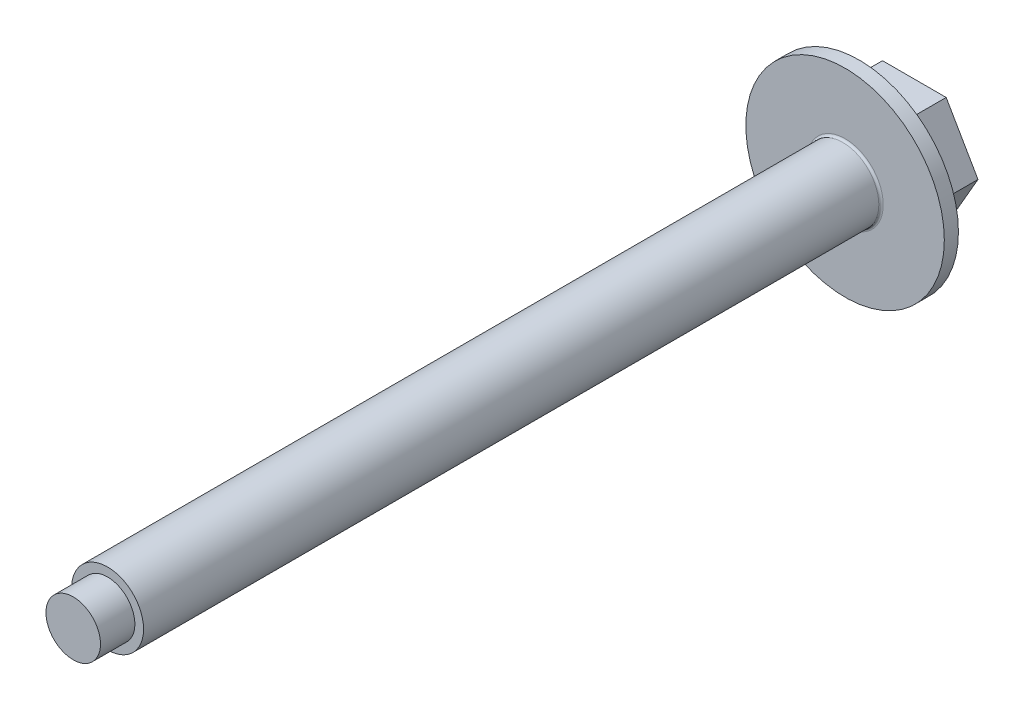
ISO-10303-21;
HEADER;
FILE_DESCRIPTION(('STEP AP214'),'2;1');
FILE_NAME('part.step','',(''),(''),'','','');
FILE_SCHEMA(('AUTOMOTIVE_DESIGN { 1 0 10303 214 1 1 1 1 }'));
ENDSEC;
DATA;
#1=APPLICATION_CONTEXT('core data for automotive mechanical design processes');
#2=APPLICATION_PROTOCOL_DEFINITION('international standard','automotive_design',2000,#1);
#3=PRODUCT_CONTEXT('',#1,'mechanical');
#4=PRODUCT('Part','Part','',(#3));
#5=PRODUCT_RELATED_PRODUCT_CATEGORY('part','',(#4));
#6=PRODUCT_DEFINITION_FORMATION('','',#4);
#7=PRODUCT_DEFINITION_CONTEXT('part definition',#1,'design');
#8=PRODUCT_DEFINITION('design','',#6,#7);
#9=PRODUCT_DEFINITION_SHAPE('','',#8);
#10=(LENGTH_UNIT() NAMED_UNIT(*) SI_UNIT(.MILLI.,.METRE.));
#11=(NAMED_UNIT(*) PLANE_ANGLE_UNIT() SI_UNIT($,.RADIAN.));
#12=(NAMED_UNIT(*) SI_UNIT($,.STERADIAN.) SOLID_ANGLE_UNIT());
#13=UNCERTAINTY_MEASURE_WITH_UNIT(LENGTH_MEASURE(1.E-05),#10,'distance_accuracy_value','');
#14=(GEOMETRIC_REPRESENTATION_CONTEXT(3) GLOBAL_UNCERTAINTY_ASSIGNED_CONTEXT((#13)) GLOBAL_UNIT_ASSIGNED_CONTEXT((#10,
#11,#12)) REPRESENTATION_CONTEXT('',''));
#15=CARTESIAN_POINT('',(0.,0.,0.));
#16=DIRECTION('',(0.,0.,1.));
#17=DIRECTION('',(1.,0.,0.));
#18=AXIS2_PLACEMENT_3D('',#15,#16,#17);
#19=CARTESIAN_POINT('',(0.,0.,48.4378));
#20=DIRECTION('',(0.,0.,-1.));
#21=DIRECTION('',(-1.,0.,0.));
#22=AXIS2_PLACEMENT_3D('',#19,#20,#21);
#23=CYLINDRICAL_SURFACE('',#22,2.0701);
#24=CARTESIAN_POINT('',(0.,0.,4.1148));
#25=DIRECTION('',(0.,0.,1.));
#26=DIRECTION('',(1.,0.,0.));
#27=AXIS2_PLACEMENT_3D('',#24,#25,#26);
#28=CIRCLE('',#27,2.0701);
#29=CARTESIAN_POINT('',(2.0701,0.,4.1148));
#30=VERTEX_POINT('',#29);
#31=EDGE_CURVE('E56',#30,#30,#28,.T.);
#32=ORIENTED_EDGE('',*,*,#31,.T.);
#33=EDGE_LOOP('',(#32));
#34=FACE_BOUND('',#33,.T.);
#35=CARTESIAN_POINT('',(0.,0.,46.4566));
#36=DIRECTION('',(0.,0.,1.));
#37=DIRECTION('',(1.,0.,0.));
#38=AXIS2_PLACEMENT_3D('',#35,#36,#37);
#39=CIRCLE('',#38,2.0701);
#40=CARTESIAN_POINT('',(2.0701,0.,46.4566));
#41=VERTEX_POINT('',#40);
#42=EDGE_CURVE('E49',#41,#41,#39,.T.);
#43=ORIENTED_EDGE('',*,*,#42,.F.);
#44=EDGE_LOOP('',(#43));
#45=FACE_BOUND('',#44,.T.);
#46=ADVANCED_FACE('F45',(#34,#45),#23,.T.);
#47=CARTESIAN_POINT('',(1.8330871046771,-3.17499999999998,3.175));
#48=DIRECTION('',(-0.866025403784441,0.499999999999995,0.));
#49=DIRECTION('',(-0.499999999999995,-0.866025403784441,0.));
#50=AXIS2_PLACEMENT_3D('',#47,#48,#49);
#51=PLANE('',#50);
#52=DIRECTION('',(0.499999999999995,0.866025403784441,0.));
#53=VECTOR('',#52,1.);
#54=CARTESIAN_POINT('',(1.8330871046771,-3.17499999999998,0.));
#55=LINE('',#54,#53);
#56=CARTESIAN_POINT('',(1.8330871046771,-3.17499999999998,0.));
#57=VERTEX_POINT('',#56);
#58=CARTESIAN_POINT('',(3.66617420935413,0.,0.));
#59=VERTEX_POINT('',#58);
#60=EDGE_CURVE('E147',#57,#59,#55,.T.);
#61=ORIENTED_EDGE('',*,*,#60,.T.);
#62=DIRECTION('',(0.,0.,-1.));
#63=VECTOR('',#62,1.);
#64=CARTESIAN_POINT('',(3.66617420935413,0.,3.175));
#65=LINE('',#64,#63);
#66=CARTESIAN_POINT('',(3.66617420935413,0.,3.175));
#67=VERTEX_POINT('',#66);
#68=EDGE_CURVE('E172',#67,#59,#65,.T.);
#69=ORIENTED_EDGE('',*,*,#68,.F.);
#70=DIRECTION('',(0.499999999999995,0.866025403784441,0.));
#71=VECTOR('',#70,1.);
#72=CARTESIAN_POINT('',(1.8330871046771,-3.17499999999998,3.175));
#73=LINE('',#72,#71);
#74=CARTESIAN_POINT('',(1.8330871046771,-3.17499999999998,3.175));
#75=VERTEX_POINT('',#74);
#76=EDGE_CURVE('E137',#75,#67,#73,.T.);
#77=ORIENTED_EDGE('',*,*,#76,.F.);
#78=DIRECTION('',(0.,0.,-1.));
#79=VECTOR('',#78,1.);
#80=CARTESIAN_POINT('',(1.8330871046771,-3.17499999999998,3.175));
#81=LINE('',#80,#79);
#82=EDGE_CURVE('E146',#75,#57,#81,.T.);
#83=ORIENTED_EDGE('',*,*,#82,.T.);
#84=EDGE_LOOP('',(#61,#69,#77,#83));
#85=FACE_BOUND('',#84,.T.);
#86=ADVANCED_FACE('F197',(#85),#51,.F.);
#87=CARTESIAN_POINT('',(3.66617420935413,0.,3.175));
#88=DIRECTION('',(-0.866025403784438,-0.500000000000001,0.));
#89=DIRECTION('',(0.500000000000001,-0.866025403784438,0.));
#90=AXIS2_PLACEMENT_3D('',#87,#88,#89);
#91=PLANE('',#90);
#92=DIRECTION('',(-0.500000000000001,0.866025403784438,0.));
#93=VECTOR('',#92,1.);
#94=CARTESIAN_POINT('',(3.66617420935413,0.,0.));
#95=LINE('',#94,#93);
#96=CARTESIAN_POINT('',(1.83308710467706,3.17500000000001,0.));
#97=VERTEX_POINT('',#96);
#98=EDGE_CURVE('E151',#59,#97,#95,.T.);
#99=ORIENTED_EDGE('',*,*,#98,.T.);
#100=DIRECTION('',(0.,0.,-1.));
#101=VECTOR('',#100,1.);
#102=CARTESIAN_POINT('',(1.83308710467706,3.17500000000001,3.175));
#103=LINE('',#102,#101);
#104=CARTESIAN_POINT('',(1.83308710467706,3.17500000000001,3.175));
#105=VERTEX_POINT('',#104);
#106=EDGE_CURVE('E120',#105,#97,#103,.T.);
#107=ORIENTED_EDGE('',*,*,#106,.F.);
#108=DIRECTION('',(-0.500000000000001,0.866025403784438,0.));
#109=VECTOR('',#108,1.);
#110=CARTESIAN_POINT('',(3.66617420935413,0.,3.175));
#111=LINE('',#110,#109);
#112=EDGE_CURVE('E101',#67,#105,#111,.T.);
#113=ORIENTED_EDGE('',*,*,#112,.F.);
#114=ORIENTED_EDGE('',*,*,#68,.T.);
#115=EDGE_LOOP('',(#99,#107,#113,#114));
#116=FACE_BOUND('',#115,.T.);
#117=ADVANCED_FACE('F202',(#116),#91,.F.);
#118=CARTESIAN_POINT('',(1.83308710467706,3.17500000000001,3.175));
#119=DIRECTION('',(0.,-1.,0.));
#120=DIRECTION('',(1.,0.,0.));
#121=AXIS2_PLACEMENT_3D('',#118,#119,#120);
#122=PLANE('',#121);
#123=DIRECTION('',(-1.,0.,0.));
#124=VECTOR('',#123,1.);
#125=CARTESIAN_POINT('',(1.83308710467706,3.17500000000001,0.));
#126=LINE('',#125,#124);
#127=CARTESIAN_POINT('',(-1.83308710467708,3.17499999999999,0.));
#128=VERTEX_POINT('',#127);
#129=EDGE_CURVE('E116',#97,#128,#126,.T.);
#130=ORIENTED_EDGE('',*,*,#129,.T.);
#131=DIRECTION('',(0.,0.,-1.));
#132=VECTOR('',#131,1.);
#133=CARTESIAN_POINT('',(-1.83308710467708,3.17499999999999,3.175));
#134=LINE('',#133,#132);
#135=CARTESIAN_POINT('',(-1.83308710467708,3.17499999999999,3.175));
#136=VERTEX_POINT('',#135);
#137=EDGE_CURVE('E109',#136,#128,#134,.T.);
#138=ORIENTED_EDGE('',*,*,#137,.F.);
#139=DIRECTION('',(-1.,0.,0.));
#140=VECTOR('',#139,1.);
#141=CARTESIAN_POINT('',(1.83308710467706,3.17500000000001,3.175));
#142=LINE('',#141,#140);
#143=EDGE_CURVE('E114',#105,#136,#142,.T.);
#144=ORIENTED_EDGE('',*,*,#143,.F.);
#145=ORIENTED_EDGE('',*,*,#106,.T.);
#146=EDGE_LOOP('',(#130,#138,#144,#145));
#147=FACE_BOUND('',#146,.T.);
#148=ADVANCED_FACE('F111',(#147),#122,.F.);
#149=CARTESIAN_POINT('',(-1.83308710467708,3.17499999999999,3.175));
#150=DIRECTION('',(0.866025403784441,-0.499999999999995,0.));
#151=DIRECTION('',(0.499999999999995,0.866025403784442,0.));
#152=AXIS2_PLACEMENT_3D('',#149,#150,#151);
#153=PLANE('',#152);
#154=DIRECTION('',(-0.499999999999995,-0.866025403784441,0.));
#155=VECTOR('',#154,1.);
#156=CARTESIAN_POINT('',(-1.83308710467708,3.17499999999999,0.));
#157=LINE('',#156,#155);
#158=CARTESIAN_POINT('',(-3.66617420935413,0.,0.));
#159=VERTEX_POINT('',#158);
#160=EDGE_CURVE('E157',#128,#159,#157,.T.);
#161=ORIENTED_EDGE('',*,*,#160,.T.);
#162=DIRECTION('',(0.,0.,-1.));
#163=VECTOR('',#162,1.);
#164=CARTESIAN_POINT('',(-3.66617420935413,0.,3.175));
#165=LINE('',#164,#163);
#166=CARTESIAN_POINT('',(-3.66617420935413,0.,3.175));
#167=VERTEX_POINT('',#166);
#168=EDGE_CURVE('E121',#167,#159,#165,.T.);
#169=ORIENTED_EDGE('',*,*,#168,.F.);
#170=DIRECTION('',(-0.499999999999995,-0.866025403784441,0.));
#171=VECTOR('',#170,1.);
#172=CARTESIAN_POINT('',(-1.83308710467708,3.17499999999999,3.175));
#173=LINE('',#172,#171);
#174=EDGE_CURVE('E124',#136,#167,#173,.T.);
#175=ORIENTED_EDGE('',*,*,#174,.F.);
#176=ORIENTED_EDGE('',*,*,#137,.T.);
#177=EDGE_LOOP('',(#161,#169,#175,#176));
#178=FACE_BOUND('',#177,.T.);
#179=ADVANCED_FACE('F125',(#178),#153,.F.);
#180=CARTESIAN_POINT('',(-3.66617420935413,0.,3.175));
#181=DIRECTION('',(0.866025403784435,0.500000000000007,0.));
#182=DIRECTION('',(-0.500000000000007,0.866025403784435,0.));
#183=AXIS2_PLACEMENT_3D('',#180,#181,#182);
#184=PLANE('',#183);
#185=DIRECTION('',(0.500000000000007,-0.866025403784435,0.));
#186=VECTOR('',#185,1.);
#187=CARTESIAN_POINT('',(-3.66617420935413,0.,0.));
#188=LINE('',#187,#186);
#189=CARTESIAN_POINT('',(-1.83308710467703,-3.17500000000002,0.));
#190=VERTEX_POINT('',#189);
#191=EDGE_CURVE('E86',#159,#190,#188,.T.);
#192=ORIENTED_EDGE('',*,*,#191,.T.);
#193=DIRECTION('',(0.,0.,-1.));
#194=VECTOR('',#193,1.);
#195=CARTESIAN_POINT('',(-1.83308710467703,-3.17500000000002,3.175));
#196=LINE('',#195,#194);
#197=CARTESIAN_POINT('',(-1.83308710467703,-3.17500000000002,3.175));
#198=VERTEX_POINT('',#197);
#199=EDGE_CURVE('E64',#198,#190,#196,.T.);
#200=ORIENTED_EDGE('',*,*,#199,.F.);
#201=DIRECTION('',(0.500000000000007,-0.866025403784435,0.));
#202=VECTOR('',#201,1.);
#203=CARTESIAN_POINT('',(-3.66617420935413,0.,3.175));
#204=LINE('',#203,#202);
#205=EDGE_CURVE('E129',#167,#198,#204,.T.);
#206=ORIENTED_EDGE('',*,*,#205,.F.);
#207=ORIENTED_EDGE('',*,*,#168,.T.);
#208=EDGE_LOOP('',(#192,#200,#206,#207));
#209=FACE_BOUND('',#208,.T.);
#210=ADVANCED_FACE('F220',(#209),#184,.F.);
#211=CARTESIAN_POINT('',(-1.83308710467703,-3.17500000000002,3.175));
#212=DIRECTION('',(0.,1.,0.));
#213=DIRECTION('',(-1.,0.,0.));
#214=AXIS2_PLACEMENT_3D('',#211,#212,#213);
#215=PLANE('',#214);
#216=DIRECTION('',(1.,0.,0.));
#217=VECTOR('',#216,1.);
#218=CARTESIAN_POINT('',(-1.83308710467703,-3.17500000000002,0.));
#219=LINE('',#218,#217);
#220=EDGE_CURVE('E92',#190,#57,#219,.T.);
#221=ORIENTED_EDGE('',*,*,#220,.T.);
#222=ORIENTED_EDGE('',*,*,#82,.F.);
#223=DIRECTION('',(1.,0.,0.));
#224=VECTOR('',#223,1.);
#225=CARTESIAN_POINT('',(-1.83308710467703,-3.17500000000002,3.175));
#226=LINE('',#225,#224);
#227=EDGE_CURVE('E143',#198,#75,#226,.T.);
#228=ORIENTED_EDGE('',*,*,#227,.F.);
#229=ORIENTED_EDGE('',*,*,#199,.T.);
#230=EDGE_LOOP('',(#221,#222,#228,#229));
#231=FACE_BOUND('',#230,.T.);
#232=ADVANCED_FACE('F216',(#231),#215,.F.);
#233=CARTESIAN_POINT('',(0.,0.,0.));
#234=DIRECTION('',(0.,0.,1.));
#235=DIRECTION('',(1.,0.,0.));
#236=AXIS2_PLACEMENT_3D('',#233,#234,#235);
#237=PLANE('',#236);
#238=ORIENTED_EDGE('',*,*,#60,.F.);
#239=ORIENTED_EDGE('',*,*,#220,.F.);
#240=ORIENTED_EDGE('',*,*,#191,.F.);
#241=ORIENTED_EDGE('',*,*,#160,.F.);
#242=ORIENTED_EDGE('',*,*,#129,.F.);
#243=ORIENTED_EDGE('',*,*,#98,.F.);
#244=EDGE_LOOP('',(#238,#239,#240,#241,#242,#243));
#245=FACE_BOUND('',#244,.T.);
#246=ADVANCED_FACE('F209',(#245),#237,.F.);
#247=CARTESIAN_POINT('',(0.,0.,3.175));
#248=DIRECTION('',(0.,0.,1.));
#249=DIRECTION('',(1.,0.,0.));
#250=AXIS2_PLACEMENT_3D('',#247,#248,#249);
#251=PLANE('',#250);
#252=CARTESIAN_POINT('',(0.,0.,3.175));
#253=DIRECTION('',(0.,0.,1.));
#254=DIRECTION('',(1.,0.,0.));
#255=AXIS2_PLACEMENT_3D('',#252,#253,#254);
#256=CIRCLE('',#255,5.715);
#257=CARTESIAN_POINT('',(5.715,0.,3.175));
#258=VERTEX_POINT('',#257);
#259=EDGE_CURVE('E234',#258,#258,#256,.T.);
#260=ORIENTED_EDGE('',*,*,#259,.F.);
#261=EDGE_LOOP('',(#260));
#262=FACE_BOUND('',#261,.T.);
#263=ORIENTED_EDGE('',*,*,#227,.T.);
#264=ORIENTED_EDGE('',*,*,#76,.T.);
#265=ORIENTED_EDGE('',*,*,#112,.T.);
#266=ORIENTED_EDGE('',*,*,#143,.T.);
#267=ORIENTED_EDGE('',*,*,#174,.T.);
#268=ORIENTED_EDGE('',*,*,#205,.T.);
#269=EDGE_LOOP('',(#263,#264,#265,#266,#267,#268));
#270=FACE_BOUND('',#269,.T.);
#271=ADVANCED_FACE('F132',(#262,#270),#251,.F.);
#272=CARTESIAN_POINT('',(0.,0.,3.9878));
#273=DIRECTION('',(0.,0.,-1.));
#274=DIRECTION('',(-1.,0.,0.));
#275=AXIS2_PLACEMENT_3D('',#272,#273,#274);
#276=CYLINDRICAL_SURFACE('',#275,5.715);
#277=CARTESIAN_POINT('',(0.,0.,3.9878));
#278=DIRECTION('',(0.,0.,1.));
#279=DIRECTION('',(1.,0.,0.));
#280=AXIS2_PLACEMENT_3D('',#277,#278,#279);
#281=CIRCLE('',#280,5.715);
#282=CARTESIAN_POINT('',(5.715,0.,3.9878));
#283=VERTEX_POINT('',#282);
#284=EDGE_CURVE('E152',#283,#283,#281,.T.);
#285=ORIENTED_EDGE('',*,*,#284,.F.);
#286=EDGE_LOOP('',(#285));
#287=FACE_BOUND('',#286,.T.);
#288=ORIENTED_EDGE('',*,*,#259,.T.);
#289=EDGE_LOOP('',(#288));
#290=FACE_BOUND('',#289,.T.);
#291=ADVANCED_FACE('F193',(#287,#290),#276,.T.);
#292=CARTESIAN_POINT('',(0.,0.,3.9878));
#293=DIRECTION('',(0.,0.,1.));
#294=DIRECTION('',(1.,0.,0.));
#295=AXIS2_PLACEMENT_3D('',#292,#293,#294);
#296=PLANE('',#295);
#297=CARTESIAN_POINT('',(0.,0.,3.9878));
#298=DIRECTION('',(0.,0.,1.));
#299=DIRECTION('',(1.,0.,0.));
#300=AXIS2_PLACEMENT_3D('',#297,#298,#299);
#301=CIRCLE('',#300,2.1971);
#302=CARTESIAN_POINT('',(2.1971,0.,3.9878));
#303=VERTEX_POINT('',#302);
#304=EDGE_CURVE('E12',#303,#303,#301,.F.);
#305=ORIENTED_EDGE('',*,*,#304,.T.);
#306=EDGE_LOOP('',(#305));
#307=FACE_BOUND('',#306,.T.);
#308=ORIENTED_EDGE('',*,*,#284,.T.);
#309=EDGE_LOOP('',(#308));
#310=FACE_BOUND('',#309,.T.);
#311=ADVANCED_FACE('F183',(#307,#310),#296,.T.);
#312=CARTESIAN_POINT('',(0.,0.,4.1148));
#313=DIRECTION('',(0.,0.,1.));
#314=DIRECTION('',(1.,0.,0.));
#315=AXIS2_PLACEMENT_3D('',#312,#313,#314);
#316=TOROIDAL_SURFACE('',#315,2.1971,0.127);
#317=ORIENTED_EDGE('',*,*,#304,.F.);
#318=EDGE_LOOP('',(#317));
#319=FACE_BOUND('',#318,.T.);
#320=ORIENTED_EDGE('',*,*,#31,.F.);
#321=EDGE_LOOP('',(#320));
#322=FACE_BOUND('',#321,.T.);
#323=ADVANCED_FACE('F47',(#319,#322),#316,.F.);
#324=CARTESIAN_POINT('',(0.,0.,46.4566));
#325=DIRECTION('',(0.,0.,1.));
#326=DIRECTION('',(1.,0.,0.));
#327=AXIS2_PLACEMENT_3D('',#324,#325,#326);
#328=PLANE('',#327);
#329=CARTESIAN_POINT('',(0.,0.,46.4566));
#330=DIRECTION('',(0.,0.,1.));
#331=DIRECTION('',(1.,0.,0.));
#332=AXIS2_PLACEMENT_3D('',#329,#330,#331);
#333=CIRCLE('',#332,1.5701);
#334=CARTESIAN_POINT('',(1.5701,0.,46.4566));
#335=VERTEX_POINT('',#334);
#336=EDGE_CURVE('E245',#335,#335,#333,.T.);
#337=ORIENTED_EDGE('',*,*,#336,.F.);
#338=EDGE_LOOP('',(#337));
#339=FACE_BOUND('',#338,.T.);
#340=ORIENTED_EDGE('',*,*,#42,.T.);
#341=EDGE_LOOP('',(#340));
#342=FACE_BOUND('',#341,.T.);
#343=ADVANCED_FACE('F182',(#339,#342),#328,.T.);
#344=CARTESIAN_POINT('',(0.,0.,46.4566));
#345=DIRECTION('',(0.,0.,1.));
#346=DIRECTION('',(1.,0.,0.));
#347=AXIS2_PLACEMENT_3D('',#344,#345,#346);
#348=CYLINDRICAL_SURFACE('',#347,1.5701);
#349=ORIENTED_EDGE('',*,*,#336,.T.);
#350=EDGE_LOOP('',(#349));
#351=FACE_BOUND('',#350,.T.);
#352=CARTESIAN_POINT('',(0.,0.,48.4378));
#353=DIRECTION('',(0.,0.,1.));
#354=DIRECTION('',(1.,0.,0.));
#355=AXIS2_PLACEMENT_3D('',#352,#353,#354);
#356=CIRCLE('',#355,1.5701);
#357=CARTESIAN_POINT('',(1.5701,0.,48.4378));
#358=VERTEX_POINT('',#357);
#359=EDGE_CURVE('E241',#358,#358,#356,.T.);
#360=ORIENTED_EDGE('',*,*,#359,.F.);
#361=EDGE_LOOP('',(#360));
#362=FACE_BOUND('',#361,.T.);
#363=ADVANCED_FACE('F190',(#351,#362),#348,.T.);
#364=CARTESIAN_POINT('',(0.,0.,48.4378));
#365=DIRECTION('',(0.,0.,1.));
#366=DIRECTION('',(1.,0.,0.));
#367=AXIS2_PLACEMENT_3D('',#364,#365,#366);
#368=PLANE('',#367);
#369=ORIENTED_EDGE('',*,*,#359,.T.);
#370=EDGE_LOOP('',(#369));
#371=FACE_BOUND('',#370,.T.);
#372=ADVANCED_FACE('F205',(#371),#368,.T.);
#373=CLOSED_SHELL('',(#46,#86,#117,#148,#179,#210,#232,#246,#271,#291,#311,#323,#343,#363,#372));
#374=MANIFOLD_SOLID_BREP('B2',#373);
#375=ADVANCED_BREP_SHAPE_REPRESENTATION('',(#18,#374),#14);
#376=SHAPE_DEFINITION_REPRESENTATION(#9,#375);
ENDSEC;
END-ISO-10303-21;
